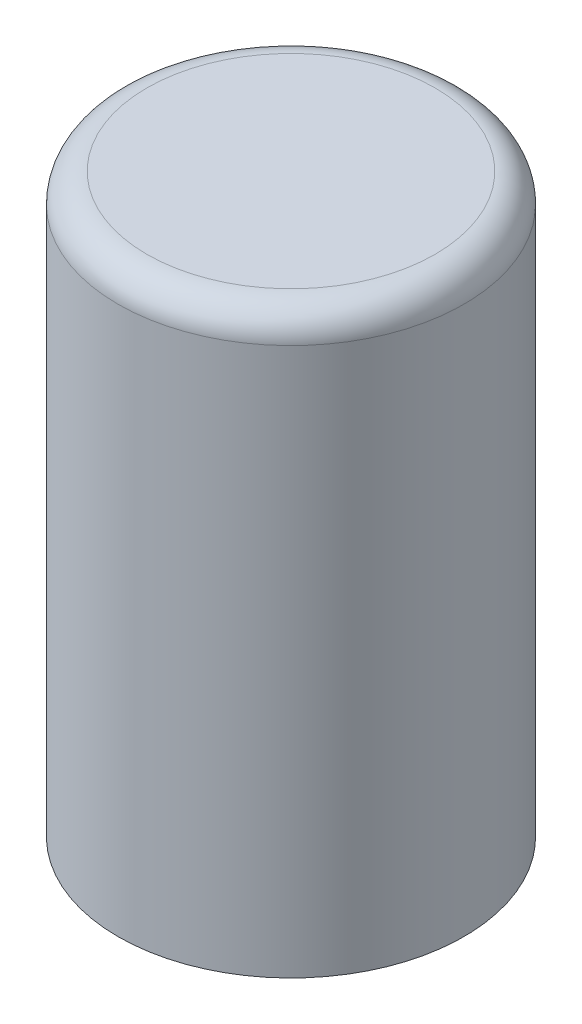
ISO-10303-21;
HEADER;
FILE_DESCRIPTION(('STEP AP214'),'2;1');
FILE_NAME('part.step','',(''),(''),'','','');
FILE_SCHEMA(('AUTOMOTIVE_DESIGN { 1 0 10303 214 1 1 1 1 }'));
ENDSEC;
DATA;
#1=APPLICATION_CONTEXT('core data for automotive mechanical design processes');
#2=APPLICATION_PROTOCOL_DEFINITION('international standard','automotive_design',2000,#1);
#3=PRODUCT_CONTEXT('',#1,'mechanical');
#4=PRODUCT('Part','Part','',(#3));
#5=PRODUCT_RELATED_PRODUCT_CATEGORY('part','',(#4));
#6=PRODUCT_DEFINITION_FORMATION('','',#4);
#7=PRODUCT_DEFINITION_CONTEXT('part definition',#1,'design');
#8=PRODUCT_DEFINITION('design','',#6,#7);
#9=PRODUCT_DEFINITION_SHAPE('','',#8);
#10=(LENGTH_UNIT() NAMED_UNIT(*) SI_UNIT(.MILLI.,.METRE.));
#11=(NAMED_UNIT(*) PLANE_ANGLE_UNIT() SI_UNIT($,.RADIAN.));
#12=(NAMED_UNIT(*) SI_UNIT($,.STERADIAN.) SOLID_ANGLE_UNIT());
#13=UNCERTAINTY_MEASURE_WITH_UNIT(LENGTH_MEASURE(1.E-05),#10,'distance_accuracy_value','');
#14=(GEOMETRIC_REPRESENTATION_CONTEXT(3) GLOBAL_UNCERTAINTY_ASSIGNED_CONTEXT((#13)) GLOBAL_UNIT_ASSIGNED_CONTEXT((#10,
#11,#12)) REPRESENTATION_CONTEXT('',''));
#15=CARTESIAN_POINT('',(0.,0.,0.));
#16=DIRECTION('',(0.,0.,1.));
#17=DIRECTION('',(1.,0.,0.));
#18=AXIS2_PLACEMENT_3D('',#15,#16,#17);
#19=CARTESIAN_POINT('',(0.,10.,0.));
#20=DIRECTION('',(0.,-1.,0.));
#21=DIRECTION('',(0.,0.,-1.));
#22=AXIS2_PLACEMENT_3D('',#19,#20,#21);
#23=CYLINDRICAL_SURFACE('',#22,3.);
#24=CARTESIAN_POINT('',(0.,9.5,0.));
#25=DIRECTION('',(0.,1.,0.));
#26=DIRECTION('',(0.,0.,1.));
#27=AXIS2_PLACEMENT_3D('',#24,#25,#26);
#28=CIRCLE('',#27,3.);
#29=CARTESIAN_POINT('',(0.,9.5,3.));
#30=VERTEX_POINT('',#29);
#31=EDGE_CURVE('E11',#30,#30,#28,.F.);
#32=ORIENTED_EDGE('',*,*,#31,.T.);
#33=EDGE_LOOP('',(#32));
#34=FACE_BOUND('',#33,.T.);
#35=CARTESIAN_POINT('',(0.,0.,0.));
#36=DIRECTION('',(0.,1.,0.));
#37=DIRECTION('',(0.,0.,1.));
#38=AXIS2_PLACEMENT_3D('',#35,#36,#37);
#39=CIRCLE('',#38,3.);
#40=CARTESIAN_POINT('',(0.,0.,3.));
#41=VERTEX_POINT('',#40);
#42=EDGE_CURVE('E124',#41,#41,#39,.T.);
#43=ORIENTED_EDGE('',*,*,#42,.T.);
#44=EDGE_LOOP('',(#43));
#45=FACE_BOUND('',#44,.T.);
#46=ADVANCED_FACE('F33',(#34,#45),#23,.T.);
#47=CARTESIAN_POINT('',(0.,10.,0.));
#48=DIRECTION('',(0.,1.,0.));
#49=DIRECTION('',(0.,0.,1.));
#50=AXIS2_PLACEMENT_3D('',#47,#48,#49);
#51=PLANE('',#50);
#52=CARTESIAN_POINT('',(0.,10.,0.));
#53=DIRECTION('',(0.,1.,0.));
#54=DIRECTION('',(0.,0.,1.));
#55=AXIS2_PLACEMENT_3D('',#52,#53,#54);
#56=CIRCLE('',#55,2.5);
#57=CARTESIAN_POINT('',(0.,10.,2.5));
#58=VERTEX_POINT('',#57);
#59=EDGE_CURVE('E41',#58,#58,#56,.T.);
#60=ORIENTED_EDGE('',*,*,#59,.T.);
#61=EDGE_LOOP('',(#60));
#62=FACE_BOUND('',#61,.T.);
#63=ADVANCED_FACE('F148',(#62),#51,.T.);
#64=CARTESIAN_POINT('',(0.,0.,0.));
#65=DIRECTION('',(0.,1.,0.));
#66=DIRECTION('',(0.,0.,1.));
#67=AXIS2_PLACEMENT_3D('',#64,#65,#66);
#68=PLANE('',#67);
#69=DIRECTION('',(0.,0.,1.));
#70=VECTOR('',#69,1.);
#71=CARTESIAN_POINT('',(1.5,0.,1.));
#72=LINE('',#71,#70);
#73=CARTESIAN_POINT('',(1.5,0.,-1.5));
#74=VERTEX_POINT('',#73);
#75=CARTESIAN_POINT('',(1.5,0.,1.5));
#76=VERTEX_POINT('',#75);
#77=EDGE_CURVE('E114',#74,#76,#72,.T.);
#78=ORIENTED_EDGE('',*,*,#77,.F.);
#79=DIRECTION('',(-1.,0.,0.));
#80=VECTOR('',#79,1.);
#81=CARTESIAN_POINT('',(0.,0.,-1.5));
#82=LINE('',#81,#80);
#83=CARTESIAN_POINT('',(-1.5,0.,-1.5));
#84=VERTEX_POINT('',#83);
#85=EDGE_CURVE('E135',#74,#84,#82,.T.);
#86=ORIENTED_EDGE('',*,*,#85,.T.);
#87=DIRECTION('',(0.,0.,-1.));
#88=VECTOR('',#87,1.);
#89=CARTESIAN_POINT('',(-1.5,0.,1.));
#90=LINE('',#89,#88);
#91=CARTESIAN_POINT('',(-1.5,0.,1.5));
#92=VERTEX_POINT('',#91);
#93=EDGE_CURVE('E116',#92,#84,#90,.T.);
#94=ORIENTED_EDGE('',*,*,#93,.F.);
#95=DIRECTION('',(1.,0.,0.));
#96=VECTOR('',#95,1.);
#97=CARTESIAN_POINT('',(0.,0.,1.5));
#98=LINE('',#97,#96);
#99=EDGE_CURVE('E132',#92,#76,#98,.T.);
#100=ORIENTED_EDGE('',*,*,#99,.T.);
#101=EDGE_LOOP('',(#78,#86,#94,#100));
#102=FACE_BOUND('',#101,.T.);
#103=ORIENTED_EDGE('',*,*,#42,.F.);
#104=EDGE_LOOP('',(#103));
#105=FACE_BOUND('',#104,.T.);
#106=ADVANCED_FACE('F164',(#102,#105),#68,.F.);
#107=CARTESIAN_POINT('',(-1.5,7.,1.));
#108=DIRECTION('',(-1.,0.,0.));
#109=DIRECTION('',(0.,0.,1.));
#110=AXIS2_PLACEMENT_3D('',#107,#108,#109);
#111=PLANE('',#110);
#112=ORIENTED_EDGE('',*,*,#93,.T.);
#113=DIRECTION('',(0.,-0.707106781186547,-0.707106781186549));
#114=VECTOR('',#113,1.);
#115=CARTESIAN_POINT('',(-1.5,4.74999999999999,3.25));
#116=LINE('',#115,#114);
#117=CARTESIAN_POINT('',(-1.5,0.5,-1.));
#118=VERTEX_POINT('',#117);
#119=EDGE_CURVE('E96',#84,#118,#116,.F.);
#120=ORIENTED_EDGE('',*,*,#119,.T.);
#121=DIRECTION('',(0.,-1.,0.));
#122=VECTOR('',#121,1.);
#123=CARTESIAN_POINT('',(-1.5,7.,-1.));
#124=LINE('',#123,#122);
#125=CARTESIAN_POINT('',(-1.5,7.,-1.));
#126=VERTEX_POINT('',#125);
#127=EDGE_CURVE('E88',#126,#118,#124,.T.);
#128=ORIENTED_EDGE('',*,*,#127,.F.);
#129=DIRECTION('',(0.,0.,-1.));
#130=VECTOR('',#129,1.);
#131=CARTESIAN_POINT('',(-1.5,7.,1.));
#132=LINE('',#131,#130);
#133=CARTESIAN_POINT('',(-1.5,7.,1.));
#134=VERTEX_POINT('',#133);
#135=EDGE_CURVE('E93',#134,#126,#132,.T.);
#136=ORIENTED_EDGE('',*,*,#135,.F.);
#137=DIRECTION('',(0.,-1.,0.));
#138=VECTOR('',#137,1.);
#139=CARTESIAN_POINT('',(-1.5,7.,1.));
#140=LINE('',#139,#138);
#141=CARTESIAN_POINT('',(-1.5,0.5,1.));
#142=VERTEX_POINT('',#141);
#143=EDGE_CURVE('E122',#134,#142,#140,.T.);
#144=ORIENTED_EDGE('',*,*,#143,.T.);
#145=DIRECTION('',(0.,0.707106781186546,-0.707106781186549));
#146=VECTOR('',#145,1.);
#147=CARTESIAN_POINT('',(-1.5,3.74999999999999,-2.25));
#148=LINE('',#147,#146);
#149=EDGE_CURVE('E56',#142,#92,#148,.F.);
#150=ORIENTED_EDGE('',*,*,#149,.T.);
#151=EDGE_LOOP('',(#112,#120,#128,#136,#144,#150));
#152=FACE_BOUND('',#151,.T.);
#153=ADVANCED_FACE('F90',(#152),#111,.F.);
#154=CARTESIAN_POINT('',(-1.5,7.,1.));
#155=DIRECTION('',(0.,0.,1.));
#156=DIRECTION('',(1.,0.,0.));
#157=AXIS2_PLACEMENT_3D('',#154,#155,#156);
#158=PLANE('',#157);
#159=DIRECTION('',(0.,-1.,0.));
#160=VECTOR('',#159,1.);
#161=CARTESIAN_POINT('',(1.5,7.,1.));
#162=LINE('',#161,#160);
#163=CARTESIAN_POINT('',(1.5,7.,1.));
#164=VERTEX_POINT('',#163);
#165=CARTESIAN_POINT('',(1.5,0.5,1.));
#166=VERTEX_POINT('',#165);
#167=EDGE_CURVE('E125',#164,#166,#162,.T.);
#168=ORIENTED_EDGE('',*,*,#167,.T.);
#169=DIRECTION('',(-1.,0.,0.));
#170=VECTOR('',#169,1.);
#171=CARTESIAN_POINT('',(-1.5,0.5,1.));
#172=LINE('',#171,#170);
#173=EDGE_CURVE('E138',#166,#142,#172,.T.);
#174=ORIENTED_EDGE('',*,*,#173,.T.);
#175=ORIENTED_EDGE('',*,*,#143,.F.);
#176=DIRECTION('',(-1.,0.,0.));
#177=VECTOR('',#176,1.);
#178=CARTESIAN_POINT('',(-1.5,7.,1.));
#179=LINE('',#178,#177);
#180=EDGE_CURVE('E101',#164,#134,#179,.T.);
#181=ORIENTED_EDGE('',*,*,#180,.F.);
#182=EDGE_LOOP('',(#168,#174,#175,#181));
#183=FACE_BOUND('',#182,.T.);
#184=ADVANCED_FACE('F178',(#183),#158,.F.);
#185=CARTESIAN_POINT('',(1.5,7.,1.));
#186=DIRECTION('',(1.,0.,0.));
#187=DIRECTION('',(0.,0.,-1.));
#188=AXIS2_PLACEMENT_3D('',#185,#186,#187);
#189=PLANE('',#188);
#190=ORIENTED_EDGE('',*,*,#77,.T.);
#191=DIRECTION('',(0.,-0.707106781186546,0.707106781186549));
#192=VECTOR('',#191,1.);
#193=CARTESIAN_POINT('',(1.5,3.74999999999999,-2.25));
#194=LINE('',#193,#192);
#195=EDGE_CURVE('E48',#76,#166,#194,.F.);
#196=ORIENTED_EDGE('',*,*,#195,.T.);
#197=ORIENTED_EDGE('',*,*,#167,.F.);
#198=DIRECTION('',(0.,0.,1.));
#199=VECTOR('',#198,1.);
#200=CARTESIAN_POINT('',(1.5,7.,1.));
#201=LINE('',#200,#199);
#202=CARTESIAN_POINT('',(1.5,7.,-1.));
#203=VERTEX_POINT('',#202);
#204=EDGE_CURVE('E110',#203,#164,#201,.T.);
#205=ORIENTED_EDGE('',*,*,#204,.F.);
#206=DIRECTION('',(0.,-1.,0.));
#207=VECTOR('',#206,1.);
#208=CARTESIAN_POINT('',(1.5,7.,-1.));
#209=LINE('',#208,#207);
#210=CARTESIAN_POINT('',(1.5,0.5,-1.));
#211=VERTEX_POINT('',#210);
#212=EDGE_CURVE('E100',#203,#211,#209,.T.);
#213=ORIENTED_EDGE('',*,*,#212,.T.);
#214=DIRECTION('',(0.,0.707106781186547,0.707106781186549));
#215=VECTOR('',#214,1.);
#216=CARTESIAN_POINT('',(1.5,4.74999999999999,3.25));
#217=LINE('',#216,#215);
#218=EDGE_CURVE('E140',#211,#74,#217,.F.);
#219=ORIENTED_EDGE('',*,*,#218,.T.);
#220=EDGE_LOOP('',(#190,#196,#197,#205,#213,#219));
#221=FACE_BOUND('',#220,.T.);
#222=ADVANCED_FACE('F176',(#221),#189,.F.);
#223=CARTESIAN_POINT('',(-1.5,7.,-1.));
#224=DIRECTION('',(0.,0.,-1.));
#225=DIRECTION('',(-1.,0.,0.));
#226=AXIS2_PLACEMENT_3D('',#223,#224,#225);
#227=PLANE('',#226);
#228=ORIENTED_EDGE('',*,*,#127,.T.);
#229=DIRECTION('',(1.,0.,0.));
#230=VECTOR('',#229,1.);
#231=CARTESIAN_POINT('',(-1.5,0.5,-1.));
#232=LINE('',#231,#230);
#233=EDGE_CURVE('E130',#118,#211,#232,.T.);
#234=ORIENTED_EDGE('',*,*,#233,.T.);
#235=ORIENTED_EDGE('',*,*,#212,.F.);
#236=DIRECTION('',(1.,0.,0.));
#237=VECTOR('',#236,1.);
#238=CARTESIAN_POINT('',(-1.5,7.,-1.));
#239=LINE('',#238,#237);
#240=EDGE_CURVE('E104',#126,#203,#239,.T.);
#241=ORIENTED_EDGE('',*,*,#240,.F.);
#242=EDGE_LOOP('',(#228,#234,#235,#241));
#243=FACE_BOUND('',#242,.T.);
#244=ADVANCED_FACE('F105',(#243),#227,.F.);
#245=CARTESIAN_POINT('',(0.,7.,0.));
#246=DIRECTION('',(0.,-1.,0.));
#247=DIRECTION('',(0.,0.,-1.));
#248=AXIS2_PLACEMENT_3D('',#245,#246,#247);
#249=PLANE('',#248);
#250=ORIENTED_EDGE('',*,*,#135,.T.);
#251=ORIENTED_EDGE('',*,*,#240,.T.);
#252=ORIENTED_EDGE('',*,*,#204,.T.);
#253=ORIENTED_EDGE('',*,*,#180,.T.);
#254=EDGE_LOOP('',(#250,#251,#252,#253));
#255=FACE_BOUND('',#254,.T.);
#256=ADVANCED_FACE('F112',(#255),#249,.T.);
#257=CARTESIAN_POINT('',(-1.5,0.5,-1.));
#258=DIRECTION('',(0.,0.707106781186549,-0.707106781186547));
#259=DIRECTION('',(1.,0.,0.));
#260=AXIS2_PLACEMENT_3D('',#257,#258,#259);
#261=PLANE('',#260);
#262=ORIENTED_EDGE('',*,*,#119,.F.);
#263=ORIENTED_EDGE('',*,*,#85,.F.);
#264=ORIENTED_EDGE('',*,*,#218,.F.);
#265=ORIENTED_EDGE('',*,*,#233,.F.);
#266=EDGE_LOOP('',(#262,#263,#264,#265));
#267=FACE_BOUND('',#266,.T.);
#268=ADVANCED_FACE('F156',(#267),#261,.F.);
#269=CARTESIAN_POINT('',(-1.5,0.5,1.));
#270=DIRECTION('',(0.,0.707106781186549,0.707106781186546));
#271=DIRECTION('',(-1.,0.,0.));
#272=AXIS2_PLACEMENT_3D('',#269,#270,#271);
#273=PLANE('',#272);
#274=ORIENTED_EDGE('',*,*,#195,.F.);
#275=ORIENTED_EDGE('',*,*,#99,.F.);
#276=ORIENTED_EDGE('',*,*,#149,.F.);
#277=ORIENTED_EDGE('',*,*,#173,.F.);
#278=EDGE_LOOP('',(#274,#275,#276,#277));
#279=FACE_BOUND('',#278,.T.);
#280=ADVANCED_FACE('F151',(#279),#273,.F.);
#281=CARTESIAN_POINT('',(0.,9.5,0.));
#282=DIRECTION('',(0.,1.,0.));
#283=DIRECTION('',(0.,0.,1.));
#284=AXIS2_PLACEMENT_3D('',#281,#282,#283);
#285=TOROIDAL_SURFACE('',#284,2.5,0.5);
#286=ORIENTED_EDGE('',*,*,#31,.F.);
#287=EDGE_LOOP('',(#286));
#288=FACE_BOUND('',#287,.T.);
#289=ORIENTED_EDGE('',*,*,#59,.F.);
#290=EDGE_LOOP('',(#289));
#291=FACE_BOUND('',#290,.T.);
#292=ADVANCED_FACE('F35',(#288,#291),#285,.T.);
#293=CLOSED_SHELL('',(#46,#63,#106,#153,#184,#222,#244,#256,#268,#280,#292));
#294=MANIFOLD_SOLID_BREP('B2',#293);
#295=ADVANCED_BREP_SHAPE_REPRESENTATION('',(#18,#294),#14);
#296=SHAPE_DEFINITION_REPRESENTATION(#9,#295);
ENDSEC;
END-ISO-10303-21;
